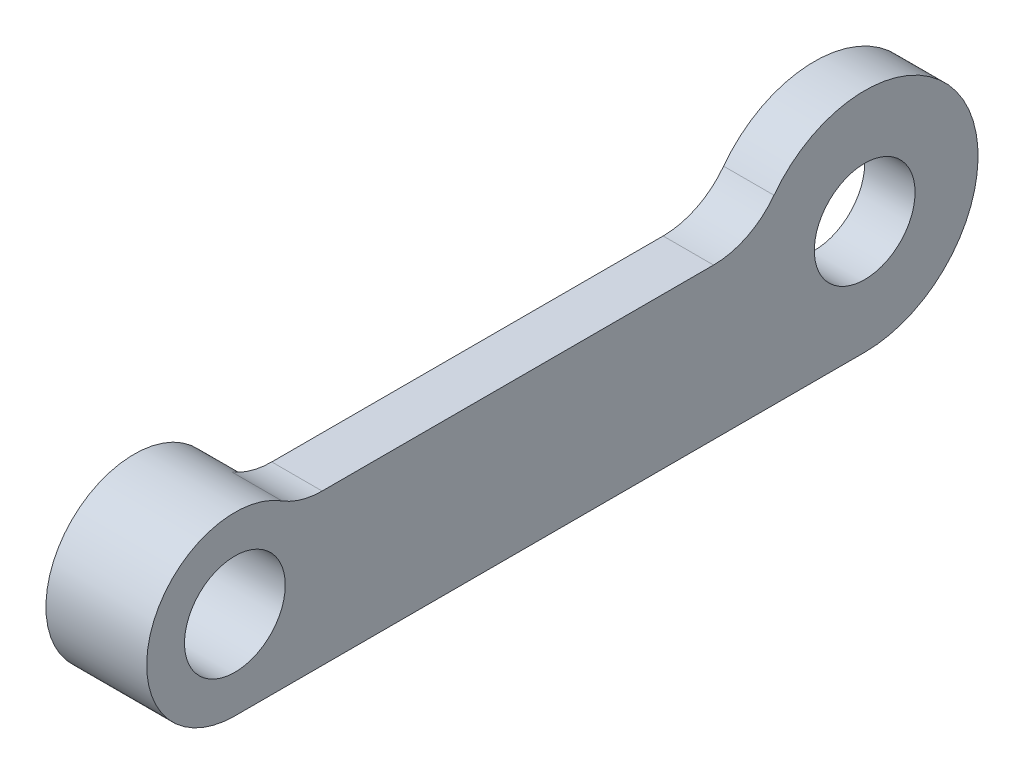
ISO-10303-21;
HEADER;
FILE_DESCRIPTION(('STEP AP214'),'2;1');
FILE_NAME('part.step','',(''),(''),'','','');
FILE_SCHEMA(('AUTOMOTIVE_DESIGN { 1 0 10303 214 1 1 1 1 }'));
ENDSEC;
DATA;
#1=APPLICATION_CONTEXT('core data for automotive mechanical design processes');
#2=APPLICATION_PROTOCOL_DEFINITION('international standard','automotive_design',2000,#1);
#3=PRODUCT_CONTEXT('',#1,'mechanical');
#4=PRODUCT('Part','Part','',(#3));
#5=PRODUCT_RELATED_PRODUCT_CATEGORY('part','',(#4));
#6=PRODUCT_DEFINITION_FORMATION('','',#4);
#7=PRODUCT_DEFINITION_CONTEXT('part definition',#1,'design');
#8=PRODUCT_DEFINITION('design','',#6,#7);
#9=PRODUCT_DEFINITION_SHAPE('','',#8);
#10=(LENGTH_UNIT() NAMED_UNIT(*) SI_UNIT(.MILLI.,.METRE.));
#11=(NAMED_UNIT(*) PLANE_ANGLE_UNIT() SI_UNIT($,.RADIAN.));
#12=(NAMED_UNIT(*) SI_UNIT($,.STERADIAN.) SOLID_ANGLE_UNIT());
#13=UNCERTAINTY_MEASURE_WITH_UNIT(LENGTH_MEASURE(1.E-05),#10,'distance_accuracy_value','');
#14=(GEOMETRIC_REPRESENTATION_CONTEXT(3) GLOBAL_UNCERTAINTY_ASSIGNED_CONTEXT((#13)) GLOBAL_UNIT_ASSIGNED_CONTEXT((#10,
#11,#12)) REPRESENTATION_CONTEXT('',''));
#15=CARTESIAN_POINT('',(0.,0.,0.));
#16=DIRECTION('',(0.,0.,1.));
#17=DIRECTION('',(1.,0.,0.));
#18=AXIS2_PLACEMENT_3D('',#15,#16,#17);
#19=CARTESIAN_POINT('',(2.,-2.5,0.));
#20=DIRECTION('',(1.,0.,0.));
#21=DIRECTION('',(0.,0.,-1.));
#22=AXIS2_PLACEMENT_3D('',#19,#20,#21);
#23=PLANE('',#22);
#24=CARTESIAN_POINT('',(2.,-2.5,0.));
#25=DIRECTION('',(1.,0.,0.));
#26=DIRECTION('',(0.,0.,-1.));
#27=AXIS2_PLACEMENT_3D('',#24,#25,#26);
#28=CIRCLE('',#27,2.);
#29=CARTESIAN_POINT('',(2.,-2.5,-2.));
#30=VERTEX_POINT('',#29);
#31=EDGE_CURVE('E169',#30,#30,#28,.T.);
#32=ORIENTED_EDGE('',*,*,#31,.F.);
#33=EDGE_LOOP('',(#32));
#34=FACE_BOUND('',#33,.T.);
#35=CARTESIAN_POINT('',(2.,-1.5,-25.));
#36=DIRECTION('',(1.,0.,0.));
#37=DIRECTION('',(0.,0.,-1.));
#38=AXIS2_PLACEMENT_3D('',#35,#36,#37);
#39=CIRCLE('',#38,2.);
#40=CARTESIAN_POINT('',(2.,-1.5,-27.));
#41=VERTEX_POINT('',#40);
#42=EDGE_CURVE('E233',#41,#41,#39,.T.);
#43=ORIENTED_EDGE('',*,*,#42,.F.);
#44=EDGE_LOOP('',(#43));
#45=FACE_BOUND('',#44,.T.);
#46=DIRECTION('',(0.,0.,-1.));
#47=VECTOR('',#46,1.);
#48=CARTESIAN_POINT('',(2.,-6.,0.));
#49=LINE('',#48,#47);
#50=CARTESIAN_POINT('',(2.,-6.,0.));
#51=VERTEX_POINT('',#50);
#52=CARTESIAN_POINT('',(2.,-6.,-25.));
#53=VERTEX_POINT('',#52);
#54=EDGE_CURVE('E137',#51,#53,#49,.T.);
#55=ORIENTED_EDGE('',*,*,#54,.T.);
#56=CARTESIAN_POINT('',(2.,-1.5,-25.));
#57=DIRECTION('',(1.,0.,0.));
#58=DIRECTION('',(0.,0.,-1.));
#59=AXIS2_PLACEMENT_3D('',#56,#57,#58);
#60=CIRCLE('',#59,4.5);
#61=CARTESIAN_POINT('',(2.,1.2,-21.4));
#62=VERTEX_POINT('',#61);
#63=EDGE_CURVE('E147',#53,#62,#60,.T.);
#64=ORIENTED_EDGE('',*,*,#63,.T.);
#65=CARTESIAN_POINT('',(2.,3.,-19.));
#66=DIRECTION('',(1.,0.,0.));
#67=DIRECTION('',(0.,0.,-1.));
#68=AXIS2_PLACEMENT_3D('',#65,#66,#67);
#69=CIRCLE('',#68,3.);
#70=CARTESIAN_POINT('',(2.,0.,-19.));
#71=VERTEX_POINT('',#70);
#72=EDGE_CURVE('E184',#62,#71,#69,.F.);
#73=ORIENTED_EDGE('',*,*,#72,.T.);
#74=DIRECTION('',(0.,0.,-1.));
#75=VECTOR('',#74,1.);
#76=CARTESIAN_POINT('',(2.,0.,0.));
#77=LINE('',#76,#75);
#78=CARTESIAN_POINT('',(2.,0.,-3.46410161513776));
#79=VERTEX_POINT('',#78);
#80=EDGE_CURVE('E156',#79,#71,#77,.T.);
#81=ORIENTED_EDGE('',*,*,#80,.F.);
#82=CARTESIAN_POINT('',(2.,3.,-3.46410161513776));
#83=DIRECTION('',(1.,0.,0.));
#84=DIRECTION('',(0.,0.,-1.));
#85=AXIS2_PLACEMENT_3D('',#82,#83,#84);
#86=CIRCLE('',#85,3.);
#87=CARTESIAN_POINT('',(2.,0.461538461538461,-1.86528548507418));
#88=VERTEX_POINT('',#87);
#89=EDGE_CURVE('E12',#79,#88,#86,.F.);
#90=ORIENTED_EDGE('',*,*,#89,.T.);
#91=CARTESIAN_POINT('',(2.,-2.5,0.));
#92=DIRECTION('',(1.,0.,0.));
#93=DIRECTION('',(0.,0.,-1.));
#94=AXIS2_PLACEMENT_3D('',#91,#92,#93);
#95=CIRCLE('',#94,3.5);
#96=EDGE_CURVE('E139',#88,#51,#95,.T.);
#97=ORIENTED_EDGE('',*,*,#96,.T.);
#98=EDGE_LOOP('',(#55,#64,#73,#81,#90,#97));
#99=FACE_BOUND('',#98,.T.);
#100=ADVANCED_FACE('F69',(#34,#45,#99),#23,.T.);
#101=CARTESIAN_POINT('',(2.,-2.5,0.));
#102=DIRECTION('',(-1.,0.,0.));
#103=DIRECTION('',(0.,0.,1.));
#104=AXIS2_PLACEMENT_3D('',#101,#102,#103);
#105=CYLINDRICAL_SURFACE('',#104,3.5);
#106=ORIENTED_EDGE('',*,*,#96,.F.);
#107=DIRECTION('',(-1.,0.,0.));
#108=VECTOR('',#107,1.);
#109=CARTESIAN_POINT('',(2.,0.461538461538461,-1.86528548507418));
#110=LINE('',#109,#108);
#111=CARTESIAN_POINT('',(0.,0.461538461538461,-1.86528548507418));
#112=VERTEX_POINT('',#111);
#113=EDGE_CURVE('E128',#88,#112,#110,.T.);
#114=ORIENTED_EDGE('',*,*,#113,.T.);
#115=CARTESIAN_POINT('',(0.,-2.5,0.));
#116=DIRECTION('',(1.,0.,0.));
#117=DIRECTION('',(0.,0.,-1.));
#118=AXIS2_PLACEMENT_3D('',#115,#116,#117);
#119=CIRCLE('',#118,3.5);
#120=CARTESIAN_POINT('',(0.,-6.,0.));
#121=VERTEX_POINT('',#120);
#122=EDGE_CURVE('E85',#121,#112,#119,.T.);
#123=ORIENTED_EDGE('',*,*,#122,.F.);
#124=DIRECTION('',(-1.,0.,0.));
#125=VECTOR('',#124,1.);
#126=CARTESIAN_POINT('',(2.,-6.,0.));
#127=LINE('',#126,#125);
#128=EDGE_CURVE('E125',#51,#121,#127,.T.);
#129=ORIENTED_EDGE('',*,*,#128,.F.);
#130=EDGE_LOOP('',(#106,#114,#123,#129));
#131=FACE_BOUND('',#130,.T.);
#132=CARTESIAN_POINT('',(-2.,-2.5,0.));
#133=DIRECTION('',(1.,0.,0.));
#134=DIRECTION('',(0.,0.,-1.));
#135=AXIS2_PLACEMENT_3D('',#132,#133,#134);
#136=CIRCLE('',#135,3.5);
#137=CARTESIAN_POINT('',(-2.,-2.5,-3.5));
#138=VERTEX_POINT('',#137);
#139=EDGE_CURVE('E164',#138,#138,#136,.T.);
#140=ORIENTED_EDGE('',*,*,#139,.T.);
#141=EDGE_LOOP('',(#140));
#142=FACE_BOUND('',#141,.T.);
#143=ADVANCED_FACE('F123',(#131,#142),#105,.T.);
#144=CARTESIAN_POINT('',(0.,-2.5,0.));
#145=DIRECTION('',(1.,0.,0.));
#146=DIRECTION('',(0.,0.,-1.));
#147=AXIS2_PLACEMENT_3D('',#144,#145,#146);
#148=PLANE('',#147);
#149=CARTESIAN_POINT('',(0.,-1.5,-25.));
#150=DIRECTION('',(1.,0.,0.));
#151=DIRECTION('',(0.,0.,-1.));
#152=AXIS2_PLACEMENT_3D('',#149,#150,#151);
#153=CIRCLE('',#152,2.);
#154=CARTESIAN_POINT('',(0.,-1.5,-27.));
#155=VERTEX_POINT('',#154);
#156=EDGE_CURVE('E165',#155,#155,#153,.F.);
#157=ORIENTED_EDGE('',*,*,#156,.F.);
#158=EDGE_LOOP('',(#157));
#159=FACE_BOUND('',#158,.T.);
#160=DIRECTION('',(0.,0.,-1.));
#161=VECTOR('',#160,1.);
#162=CARTESIAN_POINT('',(0.,-6.,0.));
#163=LINE('',#162,#161);
#164=CARTESIAN_POINT('',(0.,-6.,-25.));
#165=VERTEX_POINT('',#164);
#166=EDGE_CURVE('E135',#121,#165,#163,.T.);
#167=ORIENTED_EDGE('',*,*,#166,.F.);
#168=ORIENTED_EDGE('',*,*,#122,.T.);
#169=CARTESIAN_POINT('',(0.,3.,-3.46410161513776));
#170=DIRECTION('',(1.,0.,0.));
#171=DIRECTION('',(0.,0.,-1.));
#172=AXIS2_PLACEMENT_3D('',#169,#170,#171);
#173=CIRCLE('',#172,3.);
#174=CARTESIAN_POINT('',(0.,0.,-3.46410161513776));
#175=VERTEX_POINT('',#174);
#176=EDGE_CURVE('E78',#112,#175,#173,.T.);
#177=ORIENTED_EDGE('',*,*,#176,.T.);
#178=DIRECTION('',(0.,0.,-1.));
#179=VECTOR('',#178,1.);
#180=CARTESIAN_POINT('',(0.,0.,0.));
#181=LINE('',#180,#179);
#182=CARTESIAN_POINT('',(0.,0.,-19.));
#183=VERTEX_POINT('',#182);
#184=EDGE_CURVE('E146',#175,#183,#181,.T.);
#185=ORIENTED_EDGE('',*,*,#184,.T.);
#186=CARTESIAN_POINT('',(0.,3.,-19.));
#187=DIRECTION('',(1.,0.,0.));
#188=DIRECTION('',(0.,0.,-1.));
#189=AXIS2_PLACEMENT_3D('',#186,#187,#188);
#190=CIRCLE('',#189,3.);
#191=CARTESIAN_POINT('',(0.,1.2,-21.4));
#192=VERTEX_POINT('',#191);
#193=EDGE_CURVE('E181',#183,#192,#190,.T.);
#194=ORIENTED_EDGE('',*,*,#193,.T.);
#195=CARTESIAN_POINT('',(0.,-1.5,-25.));
#196=DIRECTION('',(1.,0.,0.));
#197=DIRECTION('',(0.,0.,-1.));
#198=AXIS2_PLACEMENT_3D('',#195,#196,#197);
#199=CIRCLE('',#198,4.5);
#200=EDGE_CURVE('E144',#165,#192,#199,.T.);
#201=ORIENTED_EDGE('',*,*,#200,.F.);
#202=EDGE_LOOP('',(#167,#168,#177,#185,#194,#201));
#203=FACE_BOUND('',#202,.T.);
#204=ADVANCED_FACE('F142',(#159,#203),#148,.F.);
#205=CARTESIAN_POINT('',(2.,-1.5,-25.));
#206=DIRECTION('',(-1.,0.,0.));
#207=DIRECTION('',(0.,0.,1.));
#208=AXIS2_PLACEMENT_3D('',#205,#206,#207);
#209=CYLINDRICAL_SURFACE('',#208,4.5);
#210=ORIENTED_EDGE('',*,*,#200,.T.);
#211=DIRECTION('',(-1.,0.,0.));
#212=VECTOR('',#211,1.);
#213=CARTESIAN_POINT('',(2.,1.2,-21.4));
#214=LINE('',#213,#212);
#215=EDGE_CURVE('E176',#192,#62,#214,.F.);
#216=ORIENTED_EDGE('',*,*,#215,.T.);
#217=ORIENTED_EDGE('',*,*,#63,.F.);
#218=DIRECTION('',(-1.,0.,0.));
#219=VECTOR('',#218,1.);
#220=CARTESIAN_POINT('',(2.,-6.,-25.));
#221=LINE('',#220,#219);
#222=EDGE_CURVE('E159',#53,#165,#221,.T.);
#223=ORIENTED_EDGE('',*,*,#222,.T.);
#224=EDGE_LOOP('',(#210,#216,#217,#223));
#225=FACE_BOUND('',#224,.T.);
#226=ADVANCED_FACE('F207',(#225),#209,.T.);
#227=CARTESIAN_POINT('',(2.,0.,0.));
#228=DIRECTION('',(0.,1.,0.));
#229=DIRECTION('',(0.,0.,1.));
#230=AXIS2_PLACEMENT_3D('',#227,#228,#229);
#231=PLANE('',#230);
#232=ORIENTED_EDGE('',*,*,#80,.T.);
#233=DIRECTION('',(-1.,0.,0.));
#234=VECTOR('',#233,1.);
#235=CARTESIAN_POINT('',(2.,0.,-19.));
#236=LINE('',#235,#234);
#237=EDGE_CURVE('E172',#71,#183,#236,.T.);
#238=ORIENTED_EDGE('',*,*,#237,.T.);
#239=ORIENTED_EDGE('',*,*,#184,.F.);
#240=DIRECTION('',(-1.,0.,0.));
#241=VECTOR('',#240,1.);
#242=CARTESIAN_POINT('',(2.,0.,-3.46410161513776));
#243=LINE('',#242,#241);
#244=EDGE_CURVE('E130',#175,#79,#243,.F.);
#245=ORIENTED_EDGE('',*,*,#244,.T.);
#246=EDGE_LOOP('',(#232,#238,#239,#245));
#247=FACE_BOUND('',#246,.T.);
#248=ADVANCED_FACE('F192',(#247),#231,.T.);
#249=CARTESIAN_POINT('',(2.,-6.,0.));
#250=DIRECTION('',(0.,1.,0.));
#251=DIRECTION('',(0.,0.,1.));
#252=AXIS2_PLACEMENT_3D('',#249,#250,#251);
#253=PLANE('',#252);
#254=ORIENTED_EDGE('',*,*,#166,.T.);
#255=ORIENTED_EDGE('',*,*,#222,.F.);
#256=ORIENTED_EDGE('',*,*,#54,.F.);
#257=ORIENTED_EDGE('',*,*,#128,.T.);
#258=EDGE_LOOP('',(#254,#255,#256,#257));
#259=FACE_BOUND('',#258,.T.);
#260=ADVANCED_FACE('F134',(#259),#253,.F.);
#261=CARTESIAN_POINT('',(-2.,-2.5,0.));
#262=DIRECTION('',(1.,0.,0.));
#263=DIRECTION('',(0.,0.,-1.));
#264=AXIS2_PLACEMENT_3D('',#261,#262,#263);
#265=PLANE('',#264);
#266=CARTESIAN_POINT('',(-2.,-2.5,0.));
#267=DIRECTION('',(1.,0.,0.));
#268=DIRECTION('',(0.,0.,-1.));
#269=AXIS2_PLACEMENT_3D('',#266,#267,#268);
#270=CIRCLE('',#269,2.);
#271=CARTESIAN_POINT('',(-2.,-2.5,-2.));
#272=VERTEX_POINT('',#271);
#273=EDGE_CURVE('E237',#272,#272,#270,.T.);
#274=ORIENTED_EDGE('',*,*,#273,.T.);
#275=EDGE_LOOP('',(#274));
#276=FACE_BOUND('',#275,.T.);
#277=ORIENTED_EDGE('',*,*,#139,.F.);
#278=EDGE_LOOP('',(#277));
#279=FACE_BOUND('',#278,.T.);
#280=ADVANCED_FACE('F212',(#276,#279),#265,.F.);
#281=CARTESIAN_POINT('',(2.,-2.5,0.));
#282=DIRECTION('',(-1.,0.,0.));
#283=DIRECTION('',(0.,0.,1.));
#284=AXIS2_PLACEMENT_3D('',#281,#282,#283);
#285=CYLINDRICAL_SURFACE('',#284,2.);
#286=ORIENTED_EDGE('',*,*,#31,.T.);
#287=EDGE_LOOP('',(#286));
#288=FACE_BOUND('',#287,.T.);
#289=ORIENTED_EDGE('',*,*,#273,.F.);
#290=EDGE_LOOP('',(#289));
#291=FACE_BOUND('',#290,.T.);
#292=ADVANCED_FACE('F247',(#288,#291),#285,.F.);
#293=CARTESIAN_POINT('',(2.,-1.5,-25.));
#294=DIRECTION('',(-1.,0.,0.));
#295=DIRECTION('',(0.,0.,1.));
#296=AXIS2_PLACEMENT_3D('',#293,#294,#295);
#297=CYLINDRICAL_SURFACE('',#296,2.);
#298=ORIENTED_EDGE('',*,*,#42,.T.);
#299=EDGE_LOOP('',(#298));
#300=FACE_BOUND('',#299,.T.);
#301=ORIENTED_EDGE('',*,*,#156,.T.);
#302=EDGE_LOOP('',(#301));
#303=FACE_BOUND('',#302,.T.);
#304=ADVANCED_FACE('F199',(#300,#303),#297,.F.);
#305=CARTESIAN_POINT('',(2.,3.,-19.));
#306=DIRECTION('',(-1.,0.,0.));
#307=DIRECTION('',(0.,0.,1.));
#308=AXIS2_PLACEMENT_3D('',#305,#306,#307);
#309=CYLINDRICAL_SURFACE('',#308,3.);
#310=ORIENTED_EDGE('',*,*,#72,.F.);
#311=ORIENTED_EDGE('',*,*,#215,.F.);
#312=ORIENTED_EDGE('',*,*,#193,.F.);
#313=ORIENTED_EDGE('',*,*,#237,.F.);
#314=EDGE_LOOP('',(#310,#311,#312,#313));
#315=FACE_BOUND('',#314,.T.);
#316=ADVANCED_FACE('F195',(#315),#309,.F.);
#317=CARTESIAN_POINT('',(2.,3.,-3.46410161513776));
#318=DIRECTION('',(-1.,0.,0.));
#319=DIRECTION('',(0.,0.,1.));
#320=AXIS2_PLACEMENT_3D('',#317,#318,#319);
#321=CYLINDRICAL_SURFACE('',#320,3.);
#322=ORIENTED_EDGE('',*,*,#89,.F.);
#323=ORIENTED_EDGE('',*,*,#244,.F.);
#324=ORIENTED_EDGE('',*,*,#176,.F.);
#325=ORIENTED_EDGE('',*,*,#113,.F.);
#326=EDGE_LOOP('',(#322,#323,#324,#325));
#327=FACE_BOUND('',#326,.T.);
#328=ADVANCED_FACE('F71',(#327),#321,.F.);
#329=CLOSED_SHELL('',(#100,#143,#204,#226,#248,#260,#280,#292,#304,#316,#328));
#330=MANIFOLD_SOLID_BREP('B2',#329);
#331=ADVANCED_BREP_SHAPE_REPRESENTATION('',(#18,#330),#14);
#332=SHAPE_DEFINITION_REPRESENTATION(#9,#331);
ENDSEC;
END-ISO-10303-21;
